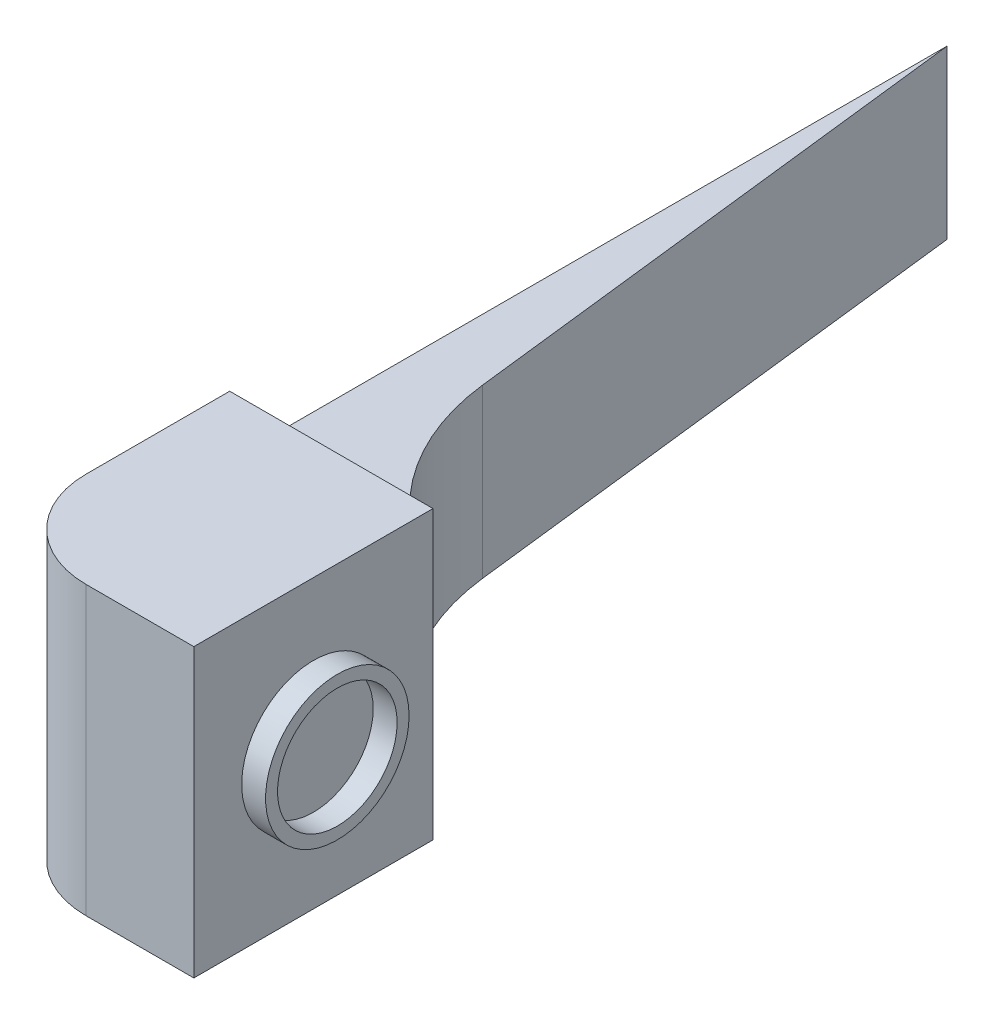
ISO-10303-21;
HEADER;
FILE_DESCRIPTION(('STEP AP214'),'2;1');
FILE_NAME('part.step','',(''),(''),'','','');
FILE_SCHEMA(('AUTOMOTIVE_DESIGN { 1 0 10303 214 1 1 1 1 }'));
ENDSEC;
DATA;
#1=APPLICATION_CONTEXT('core data for automotive mechanical design processes');
#2=APPLICATION_PROTOCOL_DEFINITION('international standard','automotive_design',2000,#1);
#3=PRODUCT_CONTEXT('',#1,'mechanical');
#4=PRODUCT('Part','Part','',(#3));
#5=PRODUCT_RELATED_PRODUCT_CATEGORY('part','',(#4));
#6=PRODUCT_DEFINITION_FORMATION('','',#4);
#7=PRODUCT_DEFINITION_CONTEXT('part definition',#1,'design');
#8=PRODUCT_DEFINITION('design','',#6,#7);
#9=PRODUCT_DEFINITION_SHAPE('','',#8);
#10=(LENGTH_UNIT() NAMED_UNIT(*) SI_UNIT(.MILLI.,.METRE.));
#11=(NAMED_UNIT(*) PLANE_ANGLE_UNIT() SI_UNIT($,.RADIAN.));
#12=(NAMED_UNIT(*) SI_UNIT($,.STERADIAN.) SOLID_ANGLE_UNIT());
#13=UNCERTAINTY_MEASURE_WITH_UNIT(LENGTH_MEASURE(1.E-05),#10,'distance_accuracy_value','');
#14=(GEOMETRIC_REPRESENTATION_CONTEXT(3) GLOBAL_UNCERTAINTY_ASSIGNED_CONTEXT((#13)) GLOBAL_UNIT_ASSIGNED_CONTEXT((#10,
#11,#12)) REPRESENTATION_CONTEXT('',''));
#15=CARTESIAN_POINT('',(0.,0.,0.));
#16=DIRECTION('',(0.,0.,1.));
#17=DIRECTION('',(1.,0.,0.));
#18=AXIS2_PLACEMENT_3D('',#15,#16,#17);
#19=CARTESIAN_POINT('',(0.,12.,0.));
#20=DIRECTION('',(0.,1.,0.));
#21=DIRECTION('',(0.,0.,1.));
#22=AXIS2_PLACEMENT_3D('',#19,#20,#21);
#23=PLANE('',#22);
#24=DIRECTION('',(0.,0.,1.));
#25=VECTOR('',#24,1.);
#26=CARTESIAN_POINT('',(10.,11.999999999999,0.));
#27=LINE('',#26,#25);
#28=CARTESIAN_POINT('',(10.,11.9999999999992,-10.));
#29=VERTEX_POINT('',#28);
#30=CARTESIAN_POINT('',(10.,11.999999999999,0.));
#31=VERTEX_POINT('',#30);
#32=EDGE_CURVE('E142',#29,#31,#27,.T.);
#33=ORIENTED_EDGE('',*,*,#32,.F.);
#34=DIRECTION('',(1.00000000000001,0.,0.));
#35=VECTOR('',#34,1.);
#36=CARTESIAN_POINT('',(1.50000000000014,12.,-10.));
#37=LINE('',#36,#35);
#38=CARTESIAN_POINT('',(1.50000000000014,12.,-10.));
#39=VERTEX_POINT('',#38);
#40=EDGE_CURVE('E127',#39,#29,#37,.T.);
#41=ORIENTED_EDGE('',*,*,#40,.F.);
#42=DIRECTION('',(0.,0.,1.));
#43=VECTOR('',#42,1.);
#44=CARTESIAN_POINT('',(1.50000000000006,12.,0.));
#45=LINE('',#44,#43);
#46=CARTESIAN_POINT('',(1.50000000000036,12.,-4.));
#47=VERTEX_POINT('',#46);
#48=EDGE_CURVE('E138',#39,#47,#45,.T.);
#49=ORIENTED_EDGE('',*,*,#48,.T.);
#50=CARTESIAN_POINT('',(5.50000000000006,11.999999999999,-4.));
#51=DIRECTION('',(0.,1.,0.));
#52=DIRECTION('',(0.,0.,1.));
#53=AXIS2_PLACEMENT_3D('',#50,#51,#52);
#54=CIRCLE('',#53,4.);
#55=CARTESIAN_POINT('',(5.50000000000006,11.9999999999989,0.));
#56=VERTEX_POINT('',#55);
#57=EDGE_CURVE('E187',#47,#56,#54,.T.);
#58=ORIENTED_EDGE('',*,*,#57,.T.);
#59=DIRECTION('',(-1.00000000000001,0.,0.));
#60=VECTOR('',#59,1.);
#61=CARTESIAN_POINT('',(0.,12.,0.));
#62=LINE('',#61,#60);
#63=EDGE_CURVE('E155',#31,#56,#62,.T.);
#64=ORIENTED_EDGE('',*,*,#63,.F.);
#65=EDGE_LOOP('',(#33,#41,#49,#58,#64));
#66=FACE_BOUND('',#65,.T.);
#67=ADVANCED_FACE('F43',(#66),#23,.T.);
#68=CARTESIAN_POINT('',(0.,12.,0.));
#69=DIRECTION('',(0.,0.,1.));
#70=DIRECTION('',(1.00000000000001,0.,0.));
#71=AXIS2_PLACEMENT_3D('',#68,#69,#70);
#72=PLANE('',#71);
#73=ORIENTED_EDGE('',*,*,#63,.T.);
#74=DIRECTION('',(0.,-1.,0.));
#75=VECTOR('',#74,1.);
#76=CARTESIAN_POINT('',(5.50000000000019,-1.07552855510562E-12,0.));
#77=LINE('',#76,#75);
#78=CARTESIAN_POINT('',(5.50000000000019,-1.07552855510562E-12,0.));
#79=VERTEX_POINT('',#78);
#80=EDGE_CURVE('E181',#56,#79,#77,.T.);
#81=ORIENTED_EDGE('',*,*,#80,.T.);
#82=DIRECTION('',(-1.00000000000001,0.,0.));
#83=VECTOR('',#82,1.);
#84=CARTESIAN_POINT('',(0.,0.,0.));
#85=LINE('',#84,#83);
#86=CARTESIAN_POINT('',(10.0000000000001,-1.02695629777827E-12,0.));
#87=VERTEX_POINT('',#86);
#88=EDGE_CURVE('E159',#87,#79,#85,.T.);
#89=ORIENTED_EDGE('',*,*,#88,.F.);
#90=DIRECTION('',(0.,-1.,0.));
#91=VECTOR('',#90,1.);
#92=CARTESIAN_POINT('',(10.,11.999999999999,0.));
#93=LINE('',#92,#91);
#94=EDGE_CURVE('E173',#31,#87,#93,.T.);
#95=ORIENTED_EDGE('',*,*,#94,.F.);
#96=EDGE_LOOP('',(#73,#81,#89,#95));
#97=FACE_BOUND('',#96,.T.);
#98=ADVANCED_FACE('F229',(#97),#72,.T.);
#99=CARTESIAN_POINT('',(10.,11.999999999999,0.));
#100=DIRECTION('',(1.00000000000001,0.,0.));
#101=DIRECTION('',(0.,0.,-1.));
#102=AXIS2_PLACEMENT_3D('',#99,#100,#101);
#103=PLANE('',#102);
#104=CARTESIAN_POINT('',(10.0000000000012,5.99999999999894,-4.99999999999973));
#105=DIRECTION('',(1.00000000000001,0.,0.));
#106=DIRECTION('',(0.,0.,-1.));
#107=AXIS2_PLACEMENT_3D('',#104,#105,#106);
#108=CIRCLE('',#107,3.);
#109=CARTESIAN_POINT('',(10.0000000000012,5.99999999999894,-7.99999999999973));
#110=VERTEX_POINT('',#109);
#111=EDGE_CURVE('E383',#110,#110,#108,.T.);
#112=ORIENTED_EDGE('',*,*,#111,.F.);
#113=EDGE_LOOP('',(#112));
#114=FACE_BOUND('',#113,.T.);
#115=DIRECTION('',(0.,0.,1.));
#116=VECTOR('',#115,1.);
#117=CARTESIAN_POINT('',(10.0000000000001,-1.02695629777827E-12,0.));
#118=LINE('',#117,#116);
#119=CARTESIAN_POINT('',(10.0000000000001,-8.04911692853238E-13,-10.));
#120=VERTEX_POINT('',#119);
#121=EDGE_CURVE('E162',#120,#87,#118,.T.);
#122=ORIENTED_EDGE('',*,*,#121,.F.);
#123=DIRECTION('',(0.,-1.,0.));
#124=VECTOR('',#123,1.);
#125=CARTESIAN_POINT('',(10.,11.9999999999992,-10.));
#126=LINE('',#125,#124);
#127=CARTESIAN_POINT('',(10.0000000000005,1.49999999999925,-10.0000000000005));
#128=VERTEX_POINT('',#127);
#129=EDGE_CURVE('E153',#128,#120,#126,.T.);
#130=ORIENTED_EDGE('',*,*,#129,.F.);
#131=CARTESIAN_POINT('',(9.99999999999995,10.4999999999994,-10.0000000000005));
#132=VERTEX_POINT('',#131);
#133=EDGE_CURVE('E174',#132,#128,#126,.T.);
#134=ORIENTED_EDGE('',*,*,#133,.F.);
#135=EDGE_CURVE('E171',#29,#132,#126,.T.);
#136=ORIENTED_EDGE('',*,*,#135,.F.);
#137=ORIENTED_EDGE('',*,*,#32,.T.);
#138=ORIENTED_EDGE('',*,*,#94,.T.);
#139=EDGE_LOOP('',(#122,#130,#134,#136,#137,#138));
#140=FACE_BOUND('',#139,.T.);
#141=ADVANCED_FACE('F234',(#114,#140),#103,.T.);
#142=CARTESIAN_POINT('',(0.,12.,-10.));
#143=DIRECTION('',(0.,0.,-1.));
#144=DIRECTION('',(-1.00000000000001,0.,0.));
#145=AXIS2_PLACEMENT_3D('',#142,#143,#144);
#146=PLANE('',#145);
#147=DIRECTION('',(0.,1.,0.));
#148=VECTOR('',#147,1.);
#149=CARTESIAN_POINT('',(1.50000000000036,0.,-10.));
#150=LINE('',#149,#148);
#151=CARTESIAN_POINT('',(1.50000000000036,0.,-10.));
#152=VERTEX_POINT('',#151);
#153=CARTESIAN_POINT('',(1.50000000000064,1.50000000000006,-10.0000000000005));
#154=VERTEX_POINT('',#153);
#155=EDGE_CURVE('E336',#152,#154,#150,.T.);
#156=ORIENTED_EDGE('',*,*,#155,.T.);
#157=DIRECTION('',(-1.00000000000001,0.,0.));
#158=VECTOR('',#157,1.);
#159=CARTESIAN_POINT('',(5.82867087928207E-13,1.50000000000006,-10.0000000000005));
#160=LINE('',#159,#158);
#161=EDGE_CURVE('E317',#154,#128,#160,.F.);
#162=ORIENTED_EDGE('',*,*,#161,.T.);
#163=ORIENTED_EDGE('',*,*,#129,.T.);
#164=DIRECTION('',(1.00000000000001,0.,0.));
#165=VECTOR('',#164,1.);
#166=CARTESIAN_POINT('',(0.,0.,-10.));
#167=LINE('',#166,#165);
#168=EDGE_CURVE('E166',#152,#120,#167,.T.);
#169=ORIENTED_EDGE('',*,*,#168,.F.);
#170=EDGE_LOOP('',(#156,#162,#163,#169));
#171=FACE_BOUND('',#170,.T.);
#172=ADVANCED_FACE('F248',(#171),#146,.T.);
#173=CARTESIAN_POINT('',(6.083858591395,11.9999999999989,-0.709783502329087));
#174=DIRECTION('',(0.993263139087251,0.,-0.115880699560178));
#175=DIRECTION('',(-0.11588069956018,0.,-0.993263139087243));
#176=AXIS2_PLACEMENT_3D('',#173,#174,#175);
#177=PLANE('',#176);
#178=DIRECTION('',(-0.11588069956018,0.,-0.993263139087243));
#179=VECTOR('',#178,1.);
#180=CARTESIAN_POINT('',(6.08385859139503,9.49999999999895,-0.709783502329364));
#181=LINE('',#180,#179);
#182=CARTESIAN_POINT('',(4.06584913709399,9.49999999999878,-18.0070073963373));
#183=VERTEX_POINT('',#182);
#184=CARTESIAN_POINT('',(1.50000000000014,9.49999999999985,-40.0000000000002));
#185=VERTEX_POINT('',#184);
#186=EDGE_CURVE('E143',#183,#185,#181,.T.);
#187=ORIENTED_EDGE('',*,*,#186,.F.);
#188=DIRECTION('',(0.,1.,0.));
#189=VECTOR('',#188,1.);
#190=CARTESIAN_POINT('',(4.06584913709418,2.49999999999891,-18.0070073963376));
#191=LINE('',#190,#189);
#192=CARTESIAN_POINT('',(4.06584913709418,2.49999999999891,-18.0070073963376));
#193=VERTEX_POINT('',#192);
#194=EDGE_CURVE('E176',#183,#193,#191,.F.);
#195=ORIENTED_EDGE('',*,*,#194,.T.);
#196=DIRECTION('',(0.11588069956018,0.,0.993263139087243));
#197=VECTOR('',#196,1.);
#198=CARTESIAN_POINT('',(6.08385859139478,2.49999999999884,-0.709783502329642));
#199=LINE('',#198,#197);
#200=CARTESIAN_POINT('',(1.50000000000006,2.4999999999995,-40.0000000000005));
#201=VERTEX_POINT('',#200);
#202=EDGE_CURVE('E163',#201,#193,#199,.T.);
#203=ORIENTED_EDGE('',*,*,#202,.F.);
#204=DIRECTION('',(0.,-1.,0.));
#205=VECTOR('',#204,1.);
#206=CARTESIAN_POINT('',(1.5000000000002,12.,-40.));
#207=LINE('',#206,#205);
#208=EDGE_CURVE('E150',#185,#201,#207,.T.);
#209=ORIENTED_EDGE('',*,*,#208,.F.);
#210=EDGE_LOOP('',(#187,#195,#203,#209));
#211=FACE_BOUND('',#210,.T.);
#212=ADVANCED_FACE('F245',(#211),#177,.T.);
#213=CARTESIAN_POINT('',(1.50000000000006,12.,0.));
#214=DIRECTION('',(1.00000000000001,0.,0.));
#215=DIRECTION('',(0.,0.,-1.));
#216=AXIS2_PLACEMENT_3D('',#213,#214,#215);
#217=PLANE('',#216);
#218=DIRECTION('',(0.,1.,0.));
#219=VECTOR('',#218,1.);
#220=CARTESIAN_POINT('',(1.50000000000036,0.,-10.));
#221=LINE('',#220,#219);
#222=CARTESIAN_POINT('',(1.50000000000008,10.5000000000002,-10.0000000000005));
#223=VERTEX_POINT('',#222);
#224=EDGE_CURVE('E123',#223,#39,#221,.T.);
#225=ORIENTED_EDGE('',*,*,#224,.F.);
#226=CARTESIAN_POINT('',(1.50000000000008,10.5000000000002,-11.0000000000005));
#227=DIRECTION('',(1.00000000000001,0.,0.));
#228=DIRECTION('',(0.,0.,-1.));
#229=AXIS2_PLACEMENT_3D('',#226,#227,#228);
#230=CIRCLE('',#229,1.);
#231=CARTESIAN_POINT('',(1.50000000000008,9.50000000000006,-11.0000000000002));
#232=VERTEX_POINT('',#231);
#233=EDGE_CURVE('E204',#223,#232,#230,.T.);
#234=ORIENTED_EDGE('',*,*,#233,.T.);
#235=DIRECTION('',(0.,0.,-1.));
#236=VECTOR('',#235,1.);
#237=CARTESIAN_POINT('',(1.49999999999978,9.50000000000006,-2.22044604925031E-13));
#238=LINE('',#237,#236);
#239=EDGE_CURVE('E133',#232,#185,#238,.T.);
#240=ORIENTED_EDGE('',*,*,#239,.T.);
#241=ORIENTED_EDGE('',*,*,#208,.T.);
#242=DIRECTION('',(0.,0.,-1.));
#243=VECTOR('',#242,1.);
#244=CARTESIAN_POINT('',(1.50000000000064,2.50000000000017,-10.0000000000005));
#245=LINE('',#244,#243);
#246=CARTESIAN_POINT('',(1.50000000000064,2.50000000000016,-11.0000000000005));
#247=VERTEX_POINT('',#246);
#248=EDGE_CURVE('E338',#247,#201,#245,.T.);
#249=ORIENTED_EDGE('',*,*,#248,.F.);
#250=CARTESIAN_POINT('',(1.50000000000064,1.50000000000005,-11.0000000000005));
#251=DIRECTION('',(1.00000000000001,0.,0.));
#252=DIRECTION('',(0.,0.,-1.));
#253=AXIS2_PLACEMENT_3D('',#250,#251,#252);
#254=CIRCLE('',#253,1.);
#255=EDGE_CURVE('E59',#247,#154,#254,.T.);
#256=ORIENTED_EDGE('',*,*,#255,.T.);
#257=ORIENTED_EDGE('',*,*,#155,.F.);
#258=DIRECTION('',(0.,0.,1.));
#259=VECTOR('',#258,1.);
#260=CARTESIAN_POINT('',(1.50000000000006,0.,0.));
#261=LINE('',#260,#259);
#262=CARTESIAN_POINT('',(1.49999999999992,0.,-4.));
#263=VERTEX_POINT('',#262);
#264=EDGE_CURVE('E169',#152,#263,#261,.T.);
#265=ORIENTED_EDGE('',*,*,#264,.T.);
#266=DIRECTION('',(0.,-1.,0.));
#267=VECTOR('',#266,1.);
#268=CARTESIAN_POINT('',(1.50000000000036,12.,-4.));
#269=LINE('',#268,#267);
#270=EDGE_CURVE('E148',#263,#47,#269,.F.);
#271=ORIENTED_EDGE('',*,*,#270,.T.);
#272=ORIENTED_EDGE('',*,*,#48,.F.);
#273=EDGE_LOOP('',(#225,#234,#240,#241,#249,#256,#257,#265,#271,#272));
#274=FACE_BOUND('',#273,.T.);
#275=ADVANCED_FACE('F145',(#274),#217,.F.);
#276=CARTESIAN_POINT('',(0.,0.,0.));
#277=DIRECTION('',(0.,1.,0.));
#278=DIRECTION('',(0.,0.,1.));
#279=AXIS2_PLACEMENT_3D('',#276,#277,#278);
#280=PLANE('',#279);
#281=ORIENTED_EDGE('',*,*,#88,.T.);
#282=CARTESIAN_POINT('',(5.49999999999996,-1.02695629777827E-12,-4.));
#283=DIRECTION('',(0.,1.,0.));
#284=DIRECTION('',(0.,0.,1.));
#285=AXIS2_PLACEMENT_3D('',#282,#283,#284);
#286=CIRCLE('',#285,4.);
#287=EDGE_CURVE('E184',#79,#263,#286,.F.);
#288=ORIENTED_EDGE('',*,*,#287,.T.);
#289=ORIENTED_EDGE('',*,*,#264,.F.);
#290=ORIENTED_EDGE('',*,*,#168,.T.);
#291=ORIENTED_EDGE('',*,*,#121,.T.);
#292=EDGE_LOOP('',(#281,#288,#289,#290,#291));
#293=FACE_BOUND('',#292,.T.);
#294=ADVANCED_FACE('F239',(#293),#280,.F.);
#295=CARTESIAN_POINT('',(11.5000000000003,2.49999999999927,-10.0000000000005));
#296=DIRECTION('',(0.,1.,0.));
#297=DIRECTION('',(0.,0.,1.));
#298=AXIS2_PLACEMENT_3D('',#295,#296,#297);
#299=PLANE('',#298);
#300=CARTESIAN_POINT('',(13.9984805279665,2.49999999999879,-19.1658143919394));
#301=DIRECTION('',(0.,1.,0.));
#302=DIRECTION('',(0.,0.,1.));
#303=AXIS2_PLACEMENT_3D('',#300,#301,#302);
#304=CIRCLE('',#303,10.);
#305=CARTESIAN_POINT('',(8.2261781003039,2.49999999999925,-11.0000000000002));
#306=VERTEX_POINT('',#305);
#307=EDGE_CURVE('E178',#193,#306,#304,.T.);
#308=ORIENTED_EDGE('',*,*,#307,.T.);
#309=DIRECTION('',(-1.00000000000001,0.,0.));
#310=VECTOR('',#309,1.);
#311=CARTESIAN_POINT('',(11.5000000000005,2.49999999999958,-11.0000000000005));
#312=LINE('',#311,#310);
#313=EDGE_CURVE('E319',#306,#247,#312,.T.);
#314=ORIENTED_EDGE('',*,*,#313,.T.);
#315=ORIENTED_EDGE('',*,*,#248,.T.);
#316=ORIENTED_EDGE('',*,*,#202,.T.);
#317=EDGE_LOOP('',(#308,#314,#315,#316));
#318=FACE_BOUND('',#317,.T.);
#319=ADVANCED_FACE('F226',(#318),#299,.F.);
#320=CARTESIAN_POINT('',(13.9984805279665,11.9999999999989,-19.1658143919385));
#321=DIRECTION('',(0.,-1.,0.));
#322=DIRECTION('',(0.,0.,-1.));
#323=AXIS2_PLACEMENT_3D('',#320,#321,#322);
#324=CYLINDRICAL_SURFACE('',#323,10.);
#325=ORIENTED_EDGE('',*,*,#194,.F.);
#326=CARTESIAN_POINT('',(13.9984805279666,9.49999999999891,-19.1658143919389));
#327=DIRECTION('',(0.,-1.,0.));
#328=DIRECTION('',(0.,0.,-1.));
#329=AXIS2_PLACEMENT_3D('',#326,#327,#328);
#330=CIRCLE('',#329,10.);
#331=CARTESIAN_POINT('',(8.22617810030341,9.49999999999917,-11.));
#332=VERTEX_POINT('',#331);
#333=EDGE_CURVE('E189',#183,#332,#330,.F.);
#334=ORIENTED_EDGE('',*,*,#333,.T.);
#335=CARTESIAN_POINT('',(8.22617810030341,9.49999999999917,-11.));
#336=CARTESIAN_POINT('',(8.29523522822695,9.50004496829076,-10.9511745171717));
#337=CARTESIAN_POINT('',(8.36488720357273,9.50357459674383,-10.9032620392408));
#338=CARTESIAN_POINT('',(8.50495989570868,9.51716191865066,-10.8094818550355));
#339=CARTESIAN_POINT('',(8.5753808068876,9.52722130225385,-10.7636146814497));
#340=CARTESIAN_POINT('',(8.71692621794433,9.55349917557393,-10.673920980633));
#341=CARTESIAN_POINT('',(8.7880524532457,9.56975156575057,-10.6301072033139));
#342=CARTESIAN_POINT('',(8.93012850162205,9.60829058976817,-10.5449869761238));
#343=CARTESIAN_POINT('',(9.00107836479085,9.63057524824553,-10.5036797108662));
#344=CARTESIAN_POINT('',(9.15344824774868,9.68537434298336,-10.4174165851164));
#345=CARTESIAN_POINT('',(9.23475435523987,9.71894796827441,-10.3729130829361));
#346=CARTESIAN_POINT('',(9.35488829413609,9.77636647480419,-10.3092285063016));
#347=CARTESIAN_POINT('',(9.39461496924779,9.79667386894873,-10.2885188952456));
#348=CARTESIAN_POINT('',(9.47318081928192,9.83993052228059,-10.2482133864311));
#349=CARTESIAN_POINT('',(9.51202026841956,9.86287895159101,-10.2286171417013));
#350=CARTESIAN_POINT('',(9.59715765584547,9.91742183674086,-10.1863321045928));
#351=CARTESIAN_POINT('',(9.64312395101995,9.94979227712144,-10.1639643925619));
#352=CARTESIAN_POINT('',(9.73171874447792,10.0202367513535,-10.1216378188309));
#353=CARTESIAN_POINT('',(9.77435285693769,10.0583008625208,-10.1016748733686));
#354=CARTESIAN_POINT('',(9.83720818852167,10.1246920338327,-10.0727136732991));
#355=CARTESIAN_POINT('',(9.85944246967995,10.1505965872058,-10.0625797296162));
#356=CARTESIAN_POINT('',(9.90070213829298,10.2054267071168,-10.0439330104041));
#357=CARTESIAN_POINT('',(9.91973080121452,10.234349140463,-10.0354185789117));
#358=CARTESIAN_POINT('',(9.94877336718553,10.2877259657457,-10.0225075745244));
#359=CARTESIAN_POINT('',(9.95985078178128,10.3114729532163,-10.0176139453121));
#360=CARTESIAN_POINT('',(9.97837670570447,10.3605733830601,-10.0094576664835));
#361=CARTESIAN_POINT('',(9.9858377221557,10.3859209410566,-10.0061893946185));
#362=CARTESIAN_POINT('',(9.99400233017183,10.4262404332828,-10.0026181843561));
#363=CARTESIAN_POINT('',(9.99623500697692,10.4408523834497,-10.0016431100131));
#364=CARTESIAN_POINT('',(9.99924091864415,10.4703046544852,-10.0003311287812));
#365=CARTESIAN_POINT('',(10.0000090079179,10.4851455965254,-9.9999964718794));
#366=CARTESIAN_POINT('',(9.99999999999995,10.4999999999994,-10.0000000000005));
#367=B_SPLINE_CURVE_WITH_KNOTS('',3,(#335,#336,#337,#338,#339,#340,#341,#342,#343,#344,#345,
#346,#347,#348,#349,#350,#351,#352,#353,#354,#355,#356,#357,#358,#359,#360,#361,#362,#363,#364,
#365,#366),.UNSPECIFIED.,.F.,.F.,(4,2,2,2,2,2,2,2,2,2,2,2,2,2,2,4),(0.,0.253585555563233,
0.507236774918498,0.762296902559511,1.01727360747691,1.31247262490997,1.45996754038829,
1.60741623530425,1.78867142768218,1.96961433938455,2.07623501268874,2.18274607249545,
2.26245156281581,2.34187939335579,2.38623971155256,2.43075559734559),.UNSPECIFIED.);
#368=EDGE_CURVE('E196',#332,#132,#367,.T.);
#369=ORIENTED_EDGE('',*,*,#368,.T.);
#370=ORIENTED_EDGE('',*,*,#133,.T.);
#371=CARTESIAN_POINT('',(10.0000000000005,1.49999999999925,-10.0000000000005));
#372=CARTESIAN_POINT('',(10.0000724177234,1.52542269510142,-9.99997133830221));
#373=CARTESIAN_POINT('',(9.9977808022435,1.55073586363385,-10.0009679276893));
#374=CARTESIAN_POINT('',(9.98915935341931,1.60019137663865,-10.0047348250911));
#375=CARTESIAN_POINT('',(9.98288439814918,1.62434490730736,-10.0074810306558));
#376=CARTESIAN_POINT('',(9.96474417954562,1.6777527883387,-10.0154544940699));
#377=CARTESIAN_POINT('',(9.95181107157014,1.7065636476132,-10.0211586531342));
#378=CARTESIAN_POINT('',(9.9219510597418,1.76169368104175,-10.0344300980425));
#379=CARTESIAN_POINT('',(9.90500103017471,1.78799714211763,-10.0420081836262));
#380=CARTESIAN_POINT('',(9.85504638216964,1.85638609140166,-10.0645430387692));
#381=CARTESIAN_POINT('',(9.81933828484259,1.89601782619788,-10.0808547950135));
#382=CARTESIAN_POINT('',(9.74357202555821,1.96942394252791,-10.1160893175401));
#383=CARTESIAN_POINT('',(9.70350384564706,2.00318435125317,-10.1350181250695));
#384=CARTESIAN_POINT('',(9.6186278690041,2.06774111832633,-10.1758631238843));
#385=CARTESIAN_POINT('',(9.57368144126537,2.09828577644211,-10.1978844413618));
#386=CARTESIAN_POINT('',(9.4820530886528,2.1552184531336,-10.2436781541191));
#387=CARTESIAN_POINT('',(9.43536946925485,2.18160227434034,-10.2674522825772));
#388=CARTESIAN_POINT('',(9.34079308963913,2.23086361124067,-10.3165886340558));
#389=CARTESIAN_POINT('',(9.29289708446459,2.25373022155898,-10.3419554661088));
#390=CARTESIAN_POINT('',(9.19642947436376,2.2962358898136,-10.3940805095658));
#391=CARTESIAN_POINT('',(9.1478576948072,2.31587409602455,-10.4208390856998));
#392=CARTESIAN_POINT('',(9.02596368952549,2.36119923160256,-10.4893459494176));
#393=CARTESIAN_POINT('',(8.95239409201421,2.38500958476486,-10.5319069045283));
#394=CARTESIAN_POINT('',(8.80503765609946,2.4261458687953,-10.6197323694402));
#395=CARTESIAN_POINT('',(8.73125074878397,2.44346945268334,-10.6649978509115));
#396=CARTESIAN_POINT('',(8.58507366569904,2.47129188551782,-10.7573434623384));
#397=CARTESIAN_POINT('',(8.51267904289009,2.4818884416865,-10.8043865724767));
#398=CARTESIAN_POINT('',(8.40470034933185,2.49265149481707,-10.8765743635947));
#399=CARTESIAN_POINT('',(8.36881338131065,2.49538386480786,-10.9009048508508));
#400=CARTESIAN_POINT('',(8.29729127618451,2.49905687451329,-10.9500779117558));
#401=CARTESIAN_POINT('',(8.26165618258314,2.49999721189626,-10.974920571098));
#402=CARTESIAN_POINT('',(8.2261781003039,2.49999999999925,-11.0000000000002));
#403=B_SPLINE_CURVE_WITH_KNOTS('',3,(#371,#372,#373,#374,#375,#376,#377,#378,#379,#380,#381,
#382,#383,#384,#385,#386,#387,#388,#389,#390,#391,#392,#393,#394,#395,#396,#397,#398,#399,#400,
#401,#402),.UNSPECIFIED.,.F.,.F.,(4,2,2,2,2,2,2,2,2,2,2,2,2,2,2,4),(0.,0.0759693999646286,
0.15091424163987,0.246647210447744,0.342945315809119,0.509359798282828,0.67616505635997,
0.851805193838571,1.02762139557476,1.20397219257788,1.38036944046773,1.64485339931454,
1.90943295893675,2.17007595811748,2.30037019320688,2.43068640813476),.UNSPECIFIED.);
#404=EDGE_CURVE('E53',#128,#306,#403,.T.);
#405=ORIENTED_EDGE('',*,*,#404,.T.);
#406=ORIENTED_EDGE('',*,*,#307,.F.);
#407=EDGE_LOOP('',(#325,#334,#369,#370,#405,#406));
#408=FACE_BOUND('',#407,.T.);
#409=ADVANCED_FACE('F206',(#408),#324,.F.);
#410=CARTESIAN_POINT('',(5.50000000000006,11.999999999999,-4.));
#411=DIRECTION('',(0.,1.,0.));
#412=DIRECTION('',(0.,0.,1.));
#413=AXIS2_PLACEMENT_3D('',#410,#411,#412);
#414=CYLINDRICAL_SURFACE('',#413,4.);
#415=ORIENTED_EDGE('',*,*,#57,.F.);
#416=ORIENTED_EDGE('',*,*,#270,.F.);
#417=ORIENTED_EDGE('',*,*,#287,.F.);
#418=ORIENTED_EDGE('',*,*,#80,.F.);
#419=EDGE_LOOP('',(#415,#416,#417,#418));
#420=FACE_BOUND('',#419,.T.);
#421=ADVANCED_FACE('F214',(#420),#414,.T.);
#422=CARTESIAN_POINT('',(1.49999999999978,9.50000000000006,-2.22044604925031E-13));
#423=DIRECTION('',(0.,-1.,0.));
#424=DIRECTION('',(0.,0.,-1.));
#425=AXIS2_PLACEMENT_3D('',#422,#423,#424);
#426=PLANE('',#425);
#427=ORIENTED_EDGE('',*,*,#239,.F.);
#428=DIRECTION('',(1.00000000000001,0.,0.));
#429=VECTOR('',#428,1.);
#430=CARTESIAN_POINT('',(1.50000000000008,9.50000000000006,-11.0000000000002));
#431=LINE('',#430,#429);
#432=EDGE_CURVE('E192',#232,#332,#431,.T.);
#433=ORIENTED_EDGE('',*,*,#432,.T.);
#434=ORIENTED_EDGE('',*,*,#333,.F.);
#435=ORIENTED_EDGE('',*,*,#186,.T.);
#436=EDGE_LOOP('',(#427,#433,#434,#435));
#437=FACE_BOUND('',#436,.T.);
#438=ADVANCED_FACE('F216',(#437),#426,.F.);
#439=CARTESIAN_POINT('',(1.50000000000036,0.,-10.));
#440=DIRECTION('',(0.,0.,-1.));
#441=DIRECTION('',(-1.00000000000001,0.,0.));
#442=AXIS2_PLACEMENT_3D('',#439,#440,#441);
#443=PLANE('',#442);
#444=ORIENTED_EDGE('',*,*,#135,.T.);
#445=DIRECTION('',(1.00000000000001,0.,0.));
#446=VECTOR('',#445,1.);
#447=CARTESIAN_POINT('',(1.50000000000008,10.5000000000002,-10.0000000000005));
#448=LINE('',#447,#446);
#449=EDGE_CURVE('E130',#132,#223,#448,.F.);
#450=ORIENTED_EDGE('',*,*,#449,.T.);
#451=ORIENTED_EDGE('',*,*,#224,.T.);
#452=ORIENTED_EDGE('',*,*,#40,.T.);
#453=EDGE_LOOP('',(#444,#450,#451,#452));
#454=FACE_BOUND('',#453,.T.);
#455=ADVANCED_FACE('F126',(#454),#443,.T.);
#456=CARTESIAN_POINT('',(1.50000000000008,10.5000000000002,-11.0000000000005));
#457=DIRECTION('',(1.00000000000001,0.,0.));
#458=DIRECTION('',(0.,0.,-1.));
#459=AXIS2_PLACEMENT_3D('',#456,#457,#458);
#460=CYLINDRICAL_SURFACE('',#459,1.);
#461=ORIENTED_EDGE('',*,*,#233,.F.);
#462=ORIENTED_EDGE('',*,*,#449,.F.);
#463=ORIENTED_EDGE('',*,*,#368,.F.);
#464=ORIENTED_EDGE('',*,*,#432,.F.);
#465=EDGE_LOOP('',(#461,#462,#463,#464));
#466=FACE_BOUND('',#465,.T.);
#467=ADVANCED_FACE('F210',(#466),#460,.F.);
#468=CARTESIAN_POINT('',(11.5000000000005,1.49999999999947,-11.0000000000005));
#469=DIRECTION('',(-1.00000000000001,0.,0.));
#470=DIRECTION('',(0.,-1.,0.));
#471=AXIS2_PLACEMENT_3D('',#468,#469,#470);
#472=CYLINDRICAL_SURFACE('',#471,1.);
#473=ORIENTED_EDGE('',*,*,#404,.F.);
#474=ORIENTED_EDGE('',*,*,#161,.F.);
#475=ORIENTED_EDGE('',*,*,#255,.F.);
#476=ORIENTED_EDGE('',*,*,#313,.F.);
#477=EDGE_LOOP('',(#473,#474,#475,#476));
#478=FACE_BOUND('',#477,.T.);
#479=ADVANCED_FACE('F45',(#478),#472,.F.);
#480=CARTESIAN_POINT('',(11.0000000000011,5.9999999999992,-4.99999999999978));
#481=DIRECTION('',(1.00000000000001,0.,0.));
#482=DIRECTION('',(0.,0.,-1.));
#483=AXIS2_PLACEMENT_3D('',#480,#481,#482);
#484=PLANE('',#483);
#485=CARTESIAN_POINT('',(11.0000000000011,5.9999999999992,-4.99999999999978));
#486=DIRECTION('',(1.00000000000001,0.,0.));
#487=DIRECTION('',(0.,0.,-1.));
#488=AXIS2_PLACEMENT_3D('',#485,#486,#487);
#489=CIRCLE('',#488,3.);
#490=CARTESIAN_POINT('',(11.0000000000011,5.9999999999992,-7.99999999999978));
#491=VERTEX_POINT('',#490);
#492=EDGE_CURVE('E134',#491,#491,#489,.T.);
#493=ORIENTED_EDGE('',*,*,#492,.T.);
#494=EDGE_LOOP('',(#493));
#495=FACE_BOUND('',#494,.T.);
#496=CARTESIAN_POINT('',(11.0000000000011,5.9999999999992,-4.99999999999978));
#497=DIRECTION('',(1.00000000000001,0.,0.));
#498=DIRECTION('',(0.,0.,-1.));
#499=AXIS2_PLACEMENT_3D('',#496,#497,#498);
#500=CIRCLE('',#499,2.5);
#501=CARTESIAN_POINT('',(11.0000000000011,5.9999999999992,-7.49999999999978));
#502=VERTEX_POINT('',#501);
#503=EDGE_CURVE('E386',#502,#502,#500,.T.);
#504=ORIENTED_EDGE('',*,*,#503,.F.);
#505=EDGE_LOOP('',(#504));
#506=FACE_BOUND('',#505,.T.);
#507=ADVANCED_FACE('F279',(#495,#506),#484,.T.);
#508=CARTESIAN_POINT('',(11.0000000000011,5.9999999999992,-4.99999999999978));
#509=DIRECTION('',(-1.00000000000001,0.,0.));
#510=DIRECTION('',(0.,0.,1.));
#511=AXIS2_PLACEMENT_3D('',#508,#509,#510);
#512=CYLINDRICAL_SURFACE('',#511,3.);
#513=ORIENTED_EDGE('',*,*,#492,.F.);
#514=EDGE_LOOP('',(#513));
#515=FACE_BOUND('',#514,.T.);
#516=ORIENTED_EDGE('',*,*,#111,.T.);
#517=EDGE_LOOP('',(#516));
#518=FACE_BOUND('',#517,.T.);
#519=ADVANCED_FACE('F270',(#515,#518),#512,.T.);
#520=CARTESIAN_POINT('',(11.0000000000011,5.9999999999992,-4.99999999999978));
#521=DIRECTION('',(-1.00000000000001,0.,0.));
#522=DIRECTION('',(0.,0.,1.));
#523=AXIS2_PLACEMENT_3D('',#520,#521,#522);
#524=CYLINDRICAL_SURFACE('',#523,2.5);
#525=ORIENTED_EDGE('',*,*,#503,.T.);
#526=EDGE_LOOP('',(#525));
#527=FACE_BOUND('',#526,.T.);
#528=CARTESIAN_POINT('',(10.0000000000012,5.99999999999894,-4.99999999999973));
#529=DIRECTION('',(1.00000000000001,0.,0.));
#530=DIRECTION('',(0.,0.,-1.));
#531=AXIS2_PLACEMENT_3D('',#528,#529,#530);
#532=CIRCLE('',#531,2.5);
#533=CARTESIAN_POINT('',(10.0000000000012,5.99999999999894,-7.49999999999973));
#534=VERTEX_POINT('',#533);
#535=EDGE_CURVE('E11',#534,#534,#532,.F.);
#536=ORIENTED_EDGE('',*,*,#535,.T.);
#537=EDGE_LOOP('',(#536));
#538=FACE_BOUND('',#537,.T.);
#539=ADVANCED_FACE('F263',(#527,#538),#524,.F.);
#540=ORIENTED_EDGE('',*,*,#535,.F.);
#541=EDGE_LOOP('',(#540));
#542=FACE_BOUND('',#541,.T.);
#543=ADVANCED_FACE('F255',(#542),#103,.T.);
#544=CLOSED_SHELL('',(#67,#98,#141,#172,#212,#275,#294,#319,#409,#421,#438,#455,#467,#479,#507,
#519,#539,#543));
#545=MANIFOLD_SOLID_BREP('B2',#544);
#546=ADVANCED_BREP_SHAPE_REPRESENTATION('',(#18,#545),#14);
#547=SHAPE_DEFINITION_REPRESENTATION(#9,#546);
ENDSEC;
END-ISO-10303-21;
